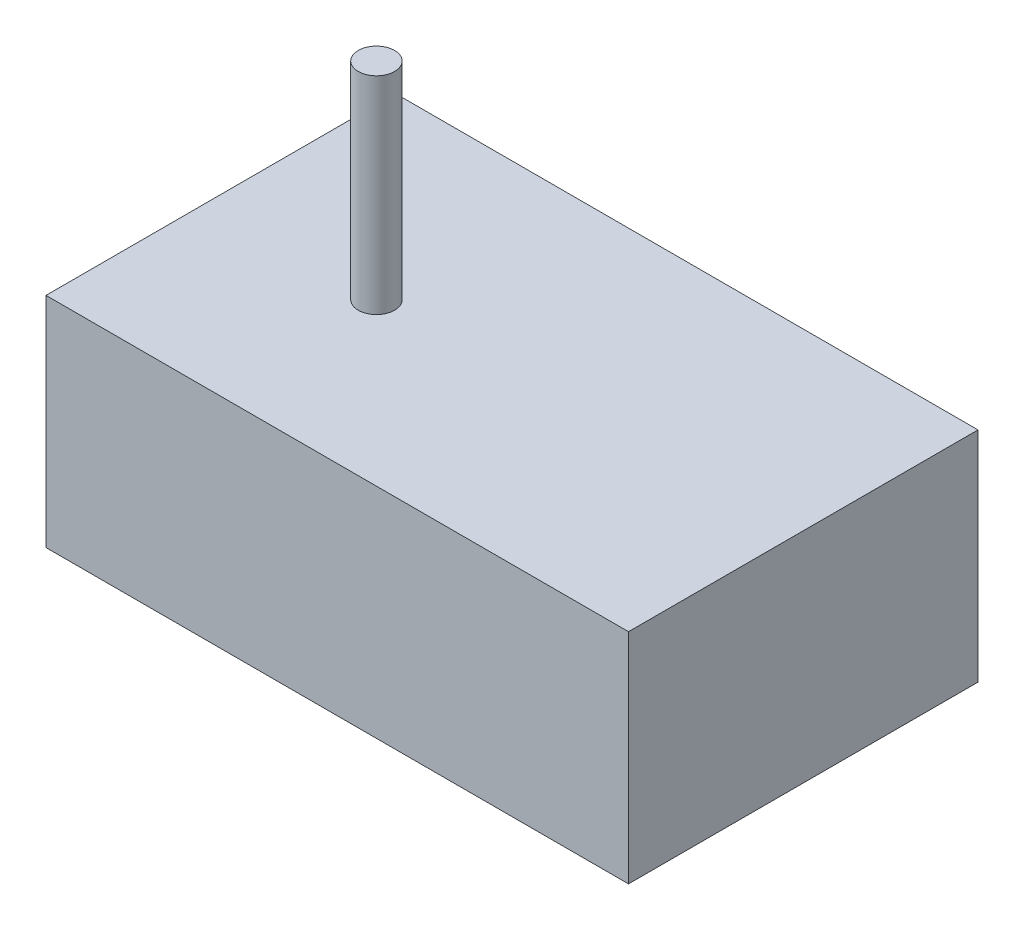
ISO-10303-21;
HEADER;
FILE_DESCRIPTION(('STEP AP214'),'2;1');
FILE_NAME('part.step','',(''),(''),'','','');
FILE_SCHEMA(('AUTOMOTIVE_DESIGN { 1 0 10303 214 1 1 1 1 }'));
ENDSEC;
DATA;
#1=APPLICATION_CONTEXT('core data for automotive mechanical design processes');
#2=APPLICATION_PROTOCOL_DEFINITION('international standard','automotive_design',2000,#1);
#3=PRODUCT_CONTEXT('',#1,'mechanical');
#4=PRODUCT('Part','Part','',(#3));
#5=PRODUCT_RELATED_PRODUCT_CATEGORY('part','',(#4));
#6=PRODUCT_DEFINITION_FORMATION('','',#4);
#7=PRODUCT_DEFINITION_CONTEXT('part definition',#1,'design');
#8=PRODUCT_DEFINITION('design','',#6,#7);
#9=PRODUCT_DEFINITION_SHAPE('','',#8);
#10=(LENGTH_UNIT() NAMED_UNIT(*) SI_UNIT(.MILLI.,.METRE.));
#11=(NAMED_UNIT(*) PLANE_ANGLE_UNIT() SI_UNIT($,.RADIAN.));
#12=(NAMED_UNIT(*) SI_UNIT($,.STERADIAN.) SOLID_ANGLE_UNIT());
#13=UNCERTAINTY_MEASURE_WITH_UNIT(LENGTH_MEASURE(1.E-05),#10,'distance_accuracy_value','');
#14=(GEOMETRIC_REPRESENTATION_CONTEXT(3) GLOBAL_UNCERTAINTY_ASSIGNED_CONTEXT((#13)) GLOBAL_UNIT_ASSIGNED_CONTEXT((#10,
#11,#12)) REPRESENTATION_CONTEXT('',''));
#15=CARTESIAN_POINT('',(0.,0.,0.));
#16=DIRECTION('',(0.,0.,1.));
#17=DIRECTION('',(1.,0.,0.));
#18=AXIS2_PLACEMENT_3D('',#15,#16,#17);
#19=CARTESIAN_POINT('',(0.,2.54,0.));
#20=DIRECTION('',(0.,1.,0.));
#21=DIRECTION('',(0.,0.,1.));
#22=AXIS2_PLACEMENT_3D('',#19,#20,#21);
#23=PLANE('',#22);
#24=CARTESIAN_POINT('',(-0.0874630145731622,2.54,-0.456757564586263));
#25=DIRECTION('',(0.,1.,0.));
#26=DIRECTION('',(0.,0.,1.));
#27=AXIS2_PLACEMENT_3D('',#24,#25,#26);
#28=CIRCLE('',#27,3.19730388073375);
#29=CARTESIAN_POINT('',(-0.0874630145731622,2.54,2.74054631614748));
#30=VERTEX_POINT('',#29);
#31=EDGE_CURVE('E210',#30,#30,#28,.T.);
#32=ORIENTED_EDGE('',*,*,#31,.F.);
#33=EDGE_LOOP('',(#32));
#34=FACE_BOUND('',#33,.T.);
#35=CARTESIAN_POINT('',(-31.75,2.54,2.54));
#36=DIRECTION('',(0.,1.,0.));
#37=DIRECTION('',(0.,0.,1.));
#38=AXIS2_PLACEMENT_3D('',#35,#36,#37);
#39=CIRCLE('',#38,3.175);
#40=CARTESIAN_POINT('',(-31.75,2.54,5.715));
#41=VERTEX_POINT('',#40);
#42=EDGE_CURVE('E215',#41,#41,#39,.T.);
#43=ORIENTED_EDGE('',*,*,#42,.F.);
#44=EDGE_LOOP('',(#43));
#45=FACE_BOUND('',#44,.T.);
#46=DIRECTION('',(0.,0.,1.));
#47=VECTOR('',#46,1.);
#48=CARTESIAN_POINT('',(-48.26,2.54,0.));
#49=LINE('',#48,#47);
#50=CARTESIAN_POINT('',(-48.26,2.54,-27.94));
#51=VERTEX_POINT('',#50);
#52=CARTESIAN_POINT('',(-48.26,2.54,27.94));
#53=VERTEX_POINT('',#52);
#54=EDGE_CURVE('E189',#51,#53,#49,.T.);
#55=ORIENTED_EDGE('',*,*,#54,.T.);
#56=DIRECTION('',(-1.,0.,0.));
#57=VECTOR('',#56,1.);
#58=CARTESIAN_POINT('',(48.26,2.54,27.94));
#59=LINE('',#58,#57);
#60=CARTESIAN_POINT('',(48.26,2.54,27.94));
#61=VERTEX_POINT('',#60);
#62=EDGE_CURVE('E73',#61,#53,#59,.T.);
#63=ORIENTED_EDGE('',*,*,#62,.F.);
#64=DIRECTION('',(0.,0.,1.));
#65=VECTOR('',#64,1.);
#66=CARTESIAN_POINT('',(48.26,2.54,0.));
#67=LINE('',#66,#65);
#68=CARTESIAN_POINT('',(48.26,2.54,-27.94));
#69=VERTEX_POINT('',#68);
#70=EDGE_CURVE('E186',#69,#61,#67,.T.);
#71=ORIENTED_EDGE('',*,*,#70,.F.);
#72=DIRECTION('',(1.,0.,0.));
#73=VECTOR('',#72,1.);
#74=CARTESIAN_POINT('',(-48.26,2.54,-27.94));
#75=LINE('',#74,#73);
#76=EDGE_CURVE('E168',#51,#69,#75,.T.);
#77=ORIENTED_EDGE('',*,*,#76,.F.);
#78=EDGE_LOOP('',(#55,#63,#71,#77));
#79=FACE_BOUND('',#78,.T.);
#80=ADVANCED_FACE('F50',(#34,#45,#79),#23,.T.);
#81=CARTESIAN_POINT('',(-48.26,35.56,0.));
#82=DIRECTION('',(1.,0.,0.));
#83=DIRECTION('',(0.,0.,-1.));
#84=AXIS2_PLACEMENT_3D('',#81,#82,#83);
#85=PLANE('',#84);
#86=DIRECTION('',(0.,0.,1.));
#87=VECTOR('',#86,1.);
#88=CARTESIAN_POINT('',(-48.26,35.56,0.));
#89=LINE('',#88,#87);
#90=CARTESIAN_POINT('',(-48.26,35.56,-27.94));
#91=VERTEX_POINT('',#90);
#92=CARTESIAN_POINT('',(-48.26,35.56,27.94));
#93=VERTEX_POINT('',#92);
#94=EDGE_CURVE('E193',#91,#93,#89,.T.);
#95=ORIENTED_EDGE('',*,*,#94,.T.);
#96=DIRECTION('',(0.,-1.,0.));
#97=VECTOR('',#96,1.);
#98=CARTESIAN_POINT('',(-48.26,35.56,27.94));
#99=LINE('',#98,#97);
#100=EDGE_CURVE('E66',#93,#53,#99,.T.);
#101=ORIENTED_EDGE('',*,*,#100,.T.);
#102=ORIENTED_EDGE('',*,*,#54,.F.);
#103=DIRECTION('',(0.,-1.,0.));
#104=VECTOR('',#103,1.);
#105=CARTESIAN_POINT('',(-48.26,35.56,-27.94));
#106=LINE('',#105,#104);
#107=EDGE_CURVE('E182',#91,#51,#106,.T.);
#108=ORIENTED_EDGE('',*,*,#107,.F.);
#109=EDGE_LOOP('',(#95,#101,#102,#108));
#110=FACE_BOUND('',#109,.T.);
#111=ADVANCED_FACE('F268',(#110),#85,.T.);
#112=CARTESIAN_POINT('',(48.26,35.56,0.));
#113=DIRECTION('',(1.,0.,0.));
#114=DIRECTION('',(0.,0.,-1.));
#115=AXIS2_PLACEMENT_3D('',#112,#113,#114);
#116=PLANE('',#115);
#117=DIRECTION('',(0.,-1.,0.));
#118=VECTOR('',#117,1.);
#119=CARTESIAN_POINT('',(48.26,35.56,27.94));
#120=LINE('',#119,#118);
#121=CARTESIAN_POINT('',(48.26,35.56,27.94));
#122=VERTEX_POINT('',#121);
#123=EDGE_CURVE('E159',#122,#61,#120,.T.);
#124=ORIENTED_EDGE('',*,*,#123,.F.);
#125=DIRECTION('',(0.,0.,1.));
#126=VECTOR('',#125,1.);
#127=CARTESIAN_POINT('',(48.26,35.56,0.));
#128=LINE('',#127,#126);
#129=CARTESIAN_POINT('',(48.26,35.56,-27.94));
#130=VERTEX_POINT('',#129);
#131=EDGE_CURVE('E185',#130,#122,#128,.T.);
#132=ORIENTED_EDGE('',*,*,#131,.F.);
#133=DIRECTION('',(0.,-1.,0.));
#134=VECTOR('',#133,1.);
#135=CARTESIAN_POINT('',(48.26,35.56,-27.94));
#136=LINE('',#135,#134);
#137=EDGE_CURVE('E176',#130,#69,#136,.T.);
#138=ORIENTED_EDGE('',*,*,#137,.T.);
#139=ORIENTED_EDGE('',*,*,#70,.T.);
#140=EDGE_LOOP('',(#124,#132,#138,#139));
#141=FACE_BOUND('',#140,.T.);
#142=ADVANCED_FACE('F247',(#141),#116,.F.);
#143=CARTESIAN_POINT('',(0.,0.,0.));
#144=DIRECTION('',(0.,1.,0.));
#145=DIRECTION('',(0.,0.,1.));
#146=AXIS2_PLACEMENT_3D('',#143,#144,#145);
#147=PLANE('',#146);
#148=CARTESIAN_POINT('',(-0.0874630145731622,0.,-0.456757564586263));
#149=DIRECTION('',(0.,1.,0.));
#150=DIRECTION('',(0.,0.,1.));
#151=AXIS2_PLACEMENT_3D('',#148,#149,#150);
#152=CIRCLE('',#151,3.19730388073375);
#153=CARTESIAN_POINT('',(-0.0874630145731622,0.,2.74054631614748));
#154=VERTEX_POINT('',#153);
#155=EDGE_CURVE('E206',#154,#154,#152,.T.);
#156=ORIENTED_EDGE('',*,*,#155,.T.);
#157=EDGE_LOOP('',(#156));
#158=FACE_BOUND('',#157,.T.);
#159=DIRECTION('',(0.,0.,1.));
#160=VECTOR('',#159,1.);
#161=CARTESIAN_POINT('',(-50.8,0.,30.48));
#162=LINE('',#161,#160);
#163=CARTESIAN_POINT('',(-50.8,0.,-30.48));
#164=VERTEX_POINT('',#163);
#165=CARTESIAN_POINT('',(-50.8,0.,30.48));
#166=VERTEX_POINT('',#165);
#167=EDGE_CURVE('E219',#164,#166,#162,.T.);
#168=ORIENTED_EDGE('',*,*,#167,.F.);
#169=DIRECTION('',(-1.,0.,0.));
#170=VECTOR('',#169,1.);
#171=CARTESIAN_POINT('',(50.8,0.,-30.48));
#172=LINE('',#171,#170);
#173=CARTESIAN_POINT('',(50.8,0.,-30.48));
#174=VERTEX_POINT('',#173);
#175=EDGE_CURVE('E231',#174,#164,#172,.T.);
#176=ORIENTED_EDGE('',*,*,#175,.F.);
#177=DIRECTION('',(0.,0.,-1.));
#178=VECTOR('',#177,1.);
#179=CARTESIAN_POINT('',(50.8,0.,30.48));
#180=LINE('',#179,#178);
#181=CARTESIAN_POINT('',(50.8,0.,30.48));
#182=VERTEX_POINT('',#181);
#183=EDGE_CURVE('E125',#182,#174,#180,.T.);
#184=ORIENTED_EDGE('',*,*,#183,.F.);
#185=DIRECTION('',(1.,0.,0.));
#186=VECTOR('',#185,1.);
#187=CARTESIAN_POINT('',(50.8,0.,30.48));
#188=LINE('',#187,#186);
#189=EDGE_CURVE('E226',#166,#182,#188,.T.);
#190=ORIENTED_EDGE('',*,*,#189,.F.);
#191=EDGE_LOOP('',(#168,#176,#184,#190));
#192=FACE_BOUND('',#191,.T.);
#193=CARTESIAN_POINT('',(-31.75,0.,2.54));
#194=DIRECTION('',(0.,1.,0.));
#195=DIRECTION('',(0.,0.,1.));
#196=AXIS2_PLACEMENT_3D('',#193,#194,#195);
#197=CIRCLE('',#196,3.175);
#198=CARTESIAN_POINT('',(-31.75,0.,5.715));
#199=VERTEX_POINT('',#198);
#200=EDGE_CURVE('E214',#199,#199,#197,.T.);
#201=ORIENTED_EDGE('',*,*,#200,.T.);
#202=EDGE_LOOP('',(#201));
#203=FACE_BOUND('',#202,.T.);
#204=ADVANCED_FACE('F244',(#158,#192,#203),#147,.F.);
#205=CARTESIAN_POINT('',(-50.8,2.54,30.48));
#206=DIRECTION('',(1.,0.,0.));
#207=DIRECTION('',(0.,0.,-1.));
#208=AXIS2_PLACEMENT_3D('',#205,#206,#207);
#209=PLANE('',#208);
#210=ORIENTED_EDGE('',*,*,#167,.T.);
#211=DIRECTION('',(0.,-1.,0.));
#212=VECTOR('',#211,1.);
#213=CARTESIAN_POINT('',(-50.8,2.54,30.48));
#214=LINE('',#213,#212);
#215=CARTESIAN_POINT('',(-50.8,38.1,30.48));
#216=VERTEX_POINT('',#215);
#217=EDGE_CURVE('E59',#216,#166,#214,.T.);
#218=ORIENTED_EDGE('',*,*,#217,.F.);
#219=DIRECTION('',(0.,0.,1.));
#220=VECTOR('',#219,1.);
#221=CARTESIAN_POINT('',(-50.8,38.1,30.48));
#222=LINE('',#221,#220);
#223=CARTESIAN_POINT('',(-50.8,38.1,-30.48));
#224=VERTEX_POINT('',#223);
#225=EDGE_CURVE('E140',#224,#216,#222,.T.);
#226=ORIENTED_EDGE('',*,*,#225,.F.);
#227=DIRECTION('',(0.,-1.,0.));
#228=VECTOR('',#227,1.);
#229=CARTESIAN_POINT('',(-50.8,2.54,-30.48));
#230=LINE('',#229,#228);
#231=EDGE_CURVE('E130',#224,#164,#230,.T.);
#232=ORIENTED_EDGE('',*,*,#231,.T.);
#233=EDGE_LOOP('',(#210,#218,#226,#232));
#234=FACE_BOUND('',#233,.T.);
#235=ADVANCED_FACE('F52',(#234),#209,.F.);
#236=CARTESIAN_POINT('',(50.8,2.54,30.48));
#237=DIRECTION('',(0.,0.,-1.));
#238=DIRECTION('',(-1.,0.,0.));
#239=AXIS2_PLACEMENT_3D('',#236,#237,#238);
#240=PLANE('',#239);
#241=ORIENTED_EDGE('',*,*,#189,.T.);
#242=DIRECTION('',(0.,-1.,0.));
#243=VECTOR('',#242,1.);
#244=CARTESIAN_POINT('',(50.8,2.54,30.48));
#245=LINE('',#244,#243);
#246=CARTESIAN_POINT('',(50.8,38.1,30.48));
#247=VERTEX_POINT('',#246);
#248=EDGE_CURVE('E129',#247,#182,#245,.T.);
#249=ORIENTED_EDGE('',*,*,#248,.F.);
#250=DIRECTION('',(1.,0.,0.));
#251=VECTOR('',#250,1.);
#252=CARTESIAN_POINT('',(50.8,38.1,30.48));
#253=LINE('',#252,#251);
#254=EDGE_CURVE('E145',#216,#247,#253,.T.);
#255=ORIENTED_EDGE('',*,*,#254,.F.);
#256=ORIENTED_EDGE('',*,*,#217,.T.);
#257=EDGE_LOOP('',(#241,#249,#255,#256));
#258=FACE_BOUND('',#257,.T.);
#259=ADVANCED_FACE('F240',(#258),#240,.F.);
#260=CARTESIAN_POINT('',(50.8,2.54,30.48));
#261=DIRECTION('',(-1.,0.,0.));
#262=DIRECTION('',(0.,0.,1.));
#263=AXIS2_PLACEMENT_3D('',#260,#261,#262);
#264=PLANE('',#263);
#265=ORIENTED_EDGE('',*,*,#183,.T.);
#266=DIRECTION('',(0.,-1.,0.));
#267=VECTOR('',#266,1.);
#268=CARTESIAN_POINT('',(50.8,2.54,-30.48));
#269=LINE('',#268,#267);
#270=CARTESIAN_POINT('',(50.8,38.1,-30.48));
#271=VERTEX_POINT('',#270);
#272=EDGE_CURVE('E118',#271,#174,#269,.T.);
#273=ORIENTED_EDGE('',*,*,#272,.F.);
#274=DIRECTION('',(0.,0.,-1.));
#275=VECTOR('',#274,1.);
#276=CARTESIAN_POINT('',(50.8,38.1,30.48));
#277=LINE('',#276,#275);
#278=EDGE_CURVE('E123',#247,#271,#277,.T.);
#279=ORIENTED_EDGE('',*,*,#278,.F.);
#280=ORIENTED_EDGE('',*,*,#248,.T.);
#281=EDGE_LOOP('',(#265,#273,#279,#280));
#282=FACE_BOUND('',#281,.T.);
#283=ADVANCED_FACE('F120',(#282),#264,.F.);
#284=CARTESIAN_POINT('',(50.8,2.54,-30.48));
#285=DIRECTION('',(0.,0.,1.));
#286=DIRECTION('',(1.,0.,0.));
#287=AXIS2_PLACEMENT_3D('',#284,#285,#286);
#288=PLANE('',#287);
#289=ORIENTED_EDGE('',*,*,#175,.T.);
#290=ORIENTED_EDGE('',*,*,#231,.F.);
#291=DIRECTION('',(-1.,0.,0.));
#292=VECTOR('',#291,1.);
#293=CARTESIAN_POINT('',(50.8,38.1,-30.48));
#294=LINE('',#293,#292);
#295=EDGE_CURVE('E133',#271,#224,#294,.T.);
#296=ORIENTED_EDGE('',*,*,#295,.F.);
#297=ORIENTED_EDGE('',*,*,#272,.T.);
#298=EDGE_LOOP('',(#289,#290,#296,#297));
#299=FACE_BOUND('',#298,.T.);
#300=ADVANCED_FACE('F134',(#299),#288,.F.);
#301=CARTESIAN_POINT('',(-31.75,2.54,2.54));
#302=DIRECTION('',(0.,-1.,0.));
#303=DIRECTION('',(0.,0.,-1.));
#304=AXIS2_PLACEMENT_3D('',#301,#302,#303);
#305=CYLINDRICAL_SURFACE('',#304,3.175);
#306=ORIENTED_EDGE('',*,*,#42,.T.);
#307=EDGE_LOOP('',(#306));
#308=FACE_BOUND('',#307,.T.);
#309=ORIENTED_EDGE('',*,*,#200,.F.);
#310=EDGE_LOOP('',(#309));
#311=FACE_BOUND('',#310,.T.);
#312=ADVANCED_FACE('F252',(#308,#311),#305,.F.);
#313=CARTESIAN_POINT('',(-0.0874630145731622,-2.54,-0.456757564586263));
#314=DIRECTION('',(0.,1.,0.));
#315=DIRECTION('',(0.,0.,1.));
#316=AXIS2_PLACEMENT_3D('',#313,#314,#315);
#317=PLANE('',#316);
#318=CARTESIAN_POINT('',(-0.0874630145731622,-2.54,-0.456757564586263));
#319=DIRECTION('',(0.,1.,0.));
#320=DIRECTION('',(0.,0.,1.));
#321=AXIS2_PLACEMENT_3D('',#318,#319,#320);
#322=CIRCLE('',#321,3.19730388073375);
#323=CARTESIAN_POINT('',(-0.0874630145731622,-2.54,2.74054631614748));
#324=VERTEX_POINT('',#323);
#325=EDGE_CURVE('E202',#324,#324,#322,.T.);
#326=ORIENTED_EDGE('',*,*,#325,.F.);
#327=EDGE_LOOP('',(#326));
#328=FACE_BOUND('',#327,.T.);
#329=ADVANCED_FACE('F254',(#328),#317,.F.);
#330=CARTESIAN_POINT('',(-0.0874630145731622,-2.54,-0.456757564586263));
#331=DIRECTION('',(0.,1.,0.));
#332=DIRECTION('',(0.,0.,1.));
#333=AXIS2_PLACEMENT_3D('',#330,#331,#332);
#334=CYLINDRICAL_SURFACE('',#333,3.19730388073375);
#335=ORIENTED_EDGE('',*,*,#325,.T.);
#336=EDGE_LOOP('',(#335));
#337=FACE_BOUND('',#336,.T.);
#338=ORIENTED_EDGE('',*,*,#155,.F.);
#339=EDGE_LOOP('',(#338));
#340=FACE_BOUND('',#339,.T.);
#341=ADVANCED_FACE('F261',(#337,#340),#334,.T.);
#342=ORIENTED_EDGE('',*,*,#31,.T.);
#343=EDGE_LOOP('',(#342));
#344=FACE_BOUND('',#343,.T.);
#345=CARTESIAN_POINT('',(-0.0874630145731622,33.02,-0.456757564586263));
#346=DIRECTION('',(0.,1.,0.));
#347=DIRECTION('',(0.,0.,1.));
#348=AXIS2_PLACEMENT_3D('',#345,#346,#347);
#349=CIRCLE('',#348,3.19730388073375);
#350=CARTESIAN_POINT('',(-0.0874630145731622,33.02,2.74054631614748));
#351=VERTEX_POINT('',#350);
#352=EDGE_CURVE('E196',#351,#351,#349,.T.);
#353=ORIENTED_EDGE('',*,*,#352,.F.);
#354=EDGE_LOOP('',(#353));
#355=FACE_BOUND('',#354,.T.);
#356=ADVANCED_FACE('F317',(#344,#355),#334,.T.);
#357=CARTESIAN_POINT('',(-0.0874630145731622,33.02,-0.456757564586263));
#358=DIRECTION('',(0.,1.,0.));
#359=DIRECTION('',(0.,0.,1.));
#360=AXIS2_PLACEMENT_3D('',#357,#358,#359);
#361=PLANE('',#360);
#362=ORIENTED_EDGE('',*,*,#352,.T.);
#363=EDGE_LOOP('',(#362));
#364=FACE_BOUND('',#363,.T.);
#365=ADVANCED_FACE('F311',(#364),#361,.T.);
#366=CARTESIAN_POINT('',(-48.26,35.56,-27.94));
#367=DIRECTION('',(0.,0.,-1.));
#368=DIRECTION('',(-1.,0.,0.));
#369=AXIS2_PLACEMENT_3D('',#366,#367,#368);
#370=PLANE('',#369);
#371=ORIENTED_EDGE('',*,*,#76,.T.);
#372=ORIENTED_EDGE('',*,*,#137,.F.);
#373=DIRECTION('',(1.,0.,0.));
#374=VECTOR('',#373,1.);
#375=CARTESIAN_POINT('',(-48.26,35.56,-27.94));
#376=LINE('',#375,#374);
#377=EDGE_CURVE('E172',#91,#130,#376,.T.);
#378=ORIENTED_EDGE('',*,*,#377,.F.);
#379=ORIENTED_EDGE('',*,*,#107,.T.);
#380=EDGE_LOOP('',(#371,#372,#378,#379));
#381=FACE_BOUND('',#380,.T.);
#382=ADVANCED_FACE('F316',(#381),#370,.F.);
#383=CARTESIAN_POINT('',(48.26,35.56,27.94));
#384=DIRECTION('',(0.,0.,1.));
#385=DIRECTION('',(1.,0.,0.));
#386=AXIS2_PLACEMENT_3D('',#383,#384,#385);
#387=PLANE('',#386);
#388=ORIENTED_EDGE('',*,*,#62,.T.);
#389=ORIENTED_EDGE('',*,*,#100,.F.);
#390=DIRECTION('',(-1.,0.,0.));
#391=VECTOR('',#390,1.);
#392=CARTESIAN_POINT('',(48.26,35.56,27.94));
#393=LINE('',#392,#391);
#394=EDGE_CURVE('E165',#122,#93,#393,.T.);
#395=ORIENTED_EDGE('',*,*,#394,.F.);
#396=ORIENTED_EDGE('',*,*,#123,.T.);
#397=EDGE_LOOP('',(#388,#389,#395,#396));
#398=FACE_BOUND('',#397,.T.);
#399=ADVANCED_FACE('F405',(#398),#387,.F.);
#400=CARTESIAN_POINT('',(0.,35.56,0.));
#401=DIRECTION('',(0.,1.,0.));
#402=DIRECTION('',(0.,0.,1.));
#403=AXIS2_PLACEMENT_3D('',#400,#401,#402);
#404=PLANE('',#403);
#405=CARTESIAN_POINT('',(-21.3251147913946,35.56,2.32003418285566));
#406=DIRECTION('',(0.,1.,0.));
#407=DIRECTION('',(0.,0.,1.));
#408=AXIS2_PLACEMENT_3D('',#405,#406,#407);
#409=CIRCLE('',#408,3.175);
#410=CARTESIAN_POINT('',(-21.3251147913946,35.56,5.49503418285566));
#411=VERTEX_POINT('',#410);
#412=EDGE_CURVE('E147',#411,#411,#409,.T.);
#413=ORIENTED_EDGE('',*,*,#412,.T.);
#414=EDGE_LOOP('',(#413));
#415=FACE_BOUND('',#414,.T.);
#416=ORIENTED_EDGE('',*,*,#377,.T.);
#417=ORIENTED_EDGE('',*,*,#131,.T.);
#418=ORIENTED_EDGE('',*,*,#394,.T.);
#419=ORIENTED_EDGE('',*,*,#94,.F.);
#420=EDGE_LOOP('',(#416,#417,#418,#419));
#421=FACE_BOUND('',#420,.T.);
#422=ADVANCED_FACE('F435',(#415,#421),#404,.F.);
#423=CARTESIAN_POINT('',(0.,38.1,0.));
#424=DIRECTION('',(0.,1.,0.));
#425=DIRECTION('',(0.,0.,1.));
#426=AXIS2_PLACEMENT_3D('',#423,#424,#425);
#427=PLANE('',#426);
#428=CARTESIAN_POINT('',(-21.3251147913946,38.1,2.32003418285566));
#429=DIRECTION('',(0.,1.,0.));
#430=DIRECTION('',(0.,0.,1.));
#431=AXIS2_PLACEMENT_3D('',#428,#429,#430);
#432=CIRCLE('',#431,3.175);
#433=CARTESIAN_POINT('',(-21.3251147913946,38.1,5.49503418285566));
#434=VERTEX_POINT('',#433);
#435=EDGE_CURVE('E12',#434,#434,#432,.T.);
#436=ORIENTED_EDGE('',*,*,#435,.F.);
#437=EDGE_LOOP('',(#436));
#438=FACE_BOUND('',#437,.T.);
#439=ORIENTED_EDGE('',*,*,#278,.T.);
#440=ORIENTED_EDGE('',*,*,#295,.T.);
#441=ORIENTED_EDGE('',*,*,#225,.T.);
#442=ORIENTED_EDGE('',*,*,#254,.T.);
#443=EDGE_LOOP('',(#439,#440,#441,#442));
#444=FACE_BOUND('',#443,.T.);
#445=ADVANCED_FACE('F143',(#438,#444),#427,.T.);
#446=CARTESIAN_POINT('',(-21.3251147913946,74.168,2.32003418285566));
#447=DIRECTION('',(0.,1.,0.));
#448=DIRECTION('',(0.,0.,1.));
#449=AXIS2_PLACEMENT_3D('',#446,#447,#448);
#450=PLANE('',#449);
#451=CARTESIAN_POINT('',(-21.3251147913946,74.168,2.32003418285566));
#452=DIRECTION('',(0.,1.,0.));
#453=DIRECTION('',(0.,0.,1.));
#454=AXIS2_PLACEMENT_3D('',#451,#452,#453);
#455=CIRCLE('',#454,3.175);
#456=CARTESIAN_POINT('',(-21.3251147913946,74.168,5.49503418285566));
#457=VERTEX_POINT('',#456);
#458=EDGE_CURVE('E526',#457,#457,#455,.T.);
#459=ORIENTED_EDGE('',*,*,#458,.T.);
#460=EDGE_LOOP('',(#459));
#461=FACE_BOUND('',#460,.T.);
#462=ADVANCED_FACE('F452',(#461),#450,.T.);
#463=CARTESIAN_POINT('',(-21.3251147913946,25.4,2.32003418285566));
#464=DIRECTION('',(0.,1.,0.));
#465=DIRECTION('',(0.,0.,1.));
#466=AXIS2_PLACEMENT_3D('',#463,#464,#465);
#467=CYLINDRICAL_SURFACE('',#466,3.175);
#468=CARTESIAN_POINT('',(-21.3251147913946,38.1,5.49503418285566));
#469=CARTESIAN_POINT('',(-21.3251147913946,38.4757083333333,5.49503418285566));
#470=CARTESIAN_POINT('',(-21.3251147913946,38.8514166666667,5.49503418285566));
#471=CARTESIAN_POINT('',(-21.3251147913946,39.6028333333333,5.49503418285566));
#472=CARTESIAN_POINT('',(-21.3251147913946,39.9785416666667,5.49503418285566));
#473=CARTESIAN_POINT('',(-21.3251147913946,40.7299583333333,5.49503418285566));
#474=CARTESIAN_POINT('',(-21.3251147913946,41.1056666666667,5.49503418285566));
#475=CARTESIAN_POINT('',(-21.3251147913946,41.8570833333333,5.49503418285566));
#476=CARTESIAN_POINT('',(-21.3251147913946,42.2327916666667,5.49503418285566));
#477=CARTESIAN_POINT('',(-21.3251147913946,42.9842083333333,5.49503418285566));
#478=CARTESIAN_POINT('',(-21.3251147913946,43.3599166666667,5.49503418285566));
#479=CARTESIAN_POINT('',(-21.3251147913946,44.1113333333333,5.49503418285566));
#480=CARTESIAN_POINT('',(-21.3251147913946,44.4870416666667,5.49503418285566));
#481=CARTESIAN_POINT('',(-21.3251147913946,45.2384583333333,5.49503418285566));
#482=CARTESIAN_POINT('',(-21.3251147913946,45.6141666666667,5.49503418285566));
#483=CARTESIAN_POINT('',(-21.3251147913946,46.3655833333333,5.49503418285566));
#484=CARTESIAN_POINT('',(-21.3251147913946,46.7412916666667,5.49503418285566));
#485=CARTESIAN_POINT('',(-21.3251147913946,47.4927083333333,5.49503418285566));
#486=CARTESIAN_POINT('',(-21.3251147913946,47.8684166666667,5.49503418285566));
#487=CARTESIAN_POINT('',(-21.3251147913946,48.6198333333333,5.49503418285566));
#488=CARTESIAN_POINT('',(-21.3251147913946,48.9955416666667,5.49503418285566));
#489=CARTESIAN_POINT('',(-21.3251147913946,49.7469583333333,5.49503418285566));
#490=CARTESIAN_POINT('',(-21.3251147913946,50.1226666666667,5.49503418285566));
#491=CARTESIAN_POINT('',(-21.3251147913946,50.8740833333333,5.49503418285566));
#492=CARTESIAN_POINT('',(-21.3251147913946,51.2497916666667,5.49503418285566));
#493=CARTESIAN_POINT('',(-21.3251147913946,52.0012083333333,5.49503418285566));
#494=CARTESIAN_POINT('',(-21.3251147913946,52.3769166666667,5.49503418285566));
#495=CARTESIAN_POINT('',(-21.3251147913946,53.1283333333333,5.49503418285566));
#496=CARTESIAN_POINT('',(-21.3251147913946,53.5040416666667,5.49503418285566));
#497=CARTESIAN_POINT('',(-21.3251147913946,54.2554583333333,5.49503418285566));
#498=CARTESIAN_POINT('',(-21.3251147913946,54.6311666666667,5.49503418285566));
#499=CARTESIAN_POINT('',(-21.3251147913946,55.3825833333333,5.49503418285566));
#500=CARTESIAN_POINT('',(-21.3251147913946,55.7582916666667,5.49503418285566));
#501=CARTESIAN_POINT('',(-21.3251147913946,56.5097083333333,5.49503418285566));
#502=CARTESIAN_POINT('',(-21.3251147913946,56.8854166666667,5.49503418285566));
#503=CARTESIAN_POINT('',(-21.3251147913946,57.6368333333333,5.49503418285566));
#504=CARTESIAN_POINT('',(-21.3251147913946,58.0125416666667,5.49503418285566));
#505=CARTESIAN_POINT('',(-21.3251147913946,58.7639583333333,5.49503418285566));
#506=CARTESIAN_POINT('',(-21.3251147913946,59.1396666666667,5.49503418285566));
#507=CARTESIAN_POINT('',(-21.3251147913946,59.8910833333333,5.49503418285566));
#508=CARTESIAN_POINT('',(-21.3251147913946,60.2667916666667,5.49503418285566));
#509=CARTESIAN_POINT('',(-21.3251147913946,61.0182083333333,5.49503418285566));
#510=CARTESIAN_POINT('',(-21.3251147913946,61.3939166666667,5.49503418285566));
#511=CARTESIAN_POINT('',(-21.3251147913946,62.1453333333333,5.49503418285566));
#512=CARTESIAN_POINT('',(-21.3251147913946,62.5210416666667,5.49503418285566));
#513=CARTESIAN_POINT('',(-21.3251147913946,63.2724583333333,5.49503418285566));
#514=CARTESIAN_POINT('',(-21.3251147913946,63.6481666666667,5.49503418285566));
#515=CARTESIAN_POINT('',(-21.3251147913946,64.3995833333333,5.49503418285566));
#516=CARTESIAN_POINT('',(-21.3251147913946,64.7752916666667,5.49503418285566));
#517=CARTESIAN_POINT('',(-21.3251147913946,65.5267083333333,5.49503418285566));
#518=CARTESIAN_POINT('',(-21.3251147913946,65.9024166666667,5.49503418285566));
#519=CARTESIAN_POINT('',(-21.3251147913946,66.6538333333333,5.49503418285566));
#520=CARTESIAN_POINT('',(-21.3251147913946,67.0295416666667,5.49503418285566));
#521=CARTESIAN_POINT('',(-21.3251147913946,67.7809583333333,5.49503418285566));
#522=CARTESIAN_POINT('',(-21.3251147913946,68.1566666666667,5.49503418285566));
#523=CARTESIAN_POINT('',(-21.3251147913946,68.9080833333333,5.49503418285566));
#524=CARTESIAN_POINT('',(-21.3251147913946,69.2837916666667,5.49503418285566));
#525=CARTESIAN_POINT('',(-21.3251147913946,70.0352083333333,5.49503418285566));
#526=CARTESIAN_POINT('',(-21.3251147913946,70.4109166666667,5.49503418285566));
#527=CARTESIAN_POINT('',(-21.3251147913946,71.1623333333333,5.49503418285566));
#528=CARTESIAN_POINT('',(-21.3251147913946,71.5380416666667,5.49503418285566));
#529=CARTESIAN_POINT('',(-21.3251147913946,72.2894583333333,5.49503418285566));
#530=CARTESIAN_POINT('',(-21.3251147913946,72.6651666666667,5.49503418285566));
#531=CARTESIAN_POINT('',(-21.3251147913946,73.4165833333333,5.49503418285566));
#532=CARTESIAN_POINT('',(-21.3251147913946,73.7922916666667,5.49503418285566));
#533=CARTESIAN_POINT('',(-21.3251147913946,74.168,5.49503418285566));
#534=B_SPLINE_CURVE_WITH_KNOTS('',3,(#468,#469,#470,#471,#472,#473,#474,#475,#476,#477,#478,
#479,#480,#481,#482,#483,#484,#485,#486,#487,#488,#489,#490,#491,#492,#493,#494,#495,#496,#497,
#498,#499,#500,#501,#502,#503,#504,#505,#506,#507,#508,#509,#510,#511,#512,#513,#514,#515,#516,
#517,#518,#519,#520,#521,#522,#523,#524,#525,#526,#527,#528,#529,#530,#531,#532,#533),
.UNSPECIFIED.,.F.,.F.,(4,2,2,2,2,2,2,2,2,2,2,2,2,2,2,2,2,2,2,2,2,2,2,2,2,2,2,2,2,2,2,2,4),(0.,
1.127125,2.25425,3.381375,4.50849999999999,5.635625,6.76275,7.889875,9.017,10.144125,11.27125,
12.398375,13.5255,14.652625,15.77975,16.906875,18.034,19.161125,20.28825,21.415375,22.5425,
23.669625,24.79675,25.923875,27.051,28.178125,29.30525,30.432375,31.5595,32.686625,33.81375,
34.940875,36.068),.UNSPECIFIED.);
#535=EDGE_CURVE('BSEAM463',#434,#457,#534,.T.);
#536=ORIENTED_EDGE('',*,*,#435,.T.);
#537=ORIENTED_EDGE('',*,*,#458,.F.);
#538=ORIENTED_EDGE('',*,*,#535,.T.);
#539=ORIENTED_EDGE('',*,*,#535,.F.);
#540=EDGE_LOOP('',(#536,#538,#537,#539));
#541=FACE_BOUND('',#540,.T.);
#542=ADVANCED_FACE('F463',(#541),#467,.T.);
#543=CARTESIAN_POINT('',(-21.3251147913946,25.4,2.32003418285566));
#544=DIRECTION('',(0.,1.,0.));
#545=DIRECTION('',(0.,0.,1.));
#546=AXIS2_PLACEMENT_3D('',#543,#544,#545);
#547=CIRCLE('',#546,3.175);
#548=CARTESIAN_POINT('',(-21.3251147913946,25.4,5.49503418285566));
#549=VERTEX_POINT('',#548);
#550=EDGE_CURVE('E151',#549,#549,#547,.T.);
#551=CARTESIAN_POINT('',(-21.3251147913946,25.4,5.49503418285566));
#552=CARTESIAN_POINT('',(-21.3251147913946,25.5058333333333,5.49503418285566));
#553=CARTESIAN_POINT('',(-21.3251147913946,25.6116666666667,5.49503418285566));
#554=CARTESIAN_POINT('',(-21.3251147913946,25.8233333333333,5.49503418285566));
#555=CARTESIAN_POINT('',(-21.3251147913946,25.9291666666667,5.49503418285566));
#556=CARTESIAN_POINT('',(-21.3251147913946,26.1408333333333,5.49503418285566));
#557=CARTESIAN_POINT('',(-21.3251147913946,26.2466666666667,5.49503418285566));
#558=CARTESIAN_POINT('',(-21.3251147913946,26.4583333333333,5.49503418285566));
#559=CARTESIAN_POINT('',(-21.3251147913946,26.5641666666667,5.49503418285566));
#560=CARTESIAN_POINT('',(-21.3251147913946,26.7758333333333,5.49503418285566));
#561=CARTESIAN_POINT('',(-21.3251147913946,26.8816666666667,5.49503418285566));
#562=CARTESIAN_POINT('',(-21.3251147913946,27.0933333333333,5.49503418285566));
#563=CARTESIAN_POINT('',(-21.3251147913946,27.1991666666667,5.49503418285566));
#564=CARTESIAN_POINT('',(-21.3251147913946,27.4108333333333,5.49503418285566));
#565=CARTESIAN_POINT('',(-21.3251147913946,27.5166666666667,5.49503418285566));
#566=CARTESIAN_POINT('',(-21.3251147913946,27.7283333333333,5.49503418285566));
#567=CARTESIAN_POINT('',(-21.3251147913946,27.8341666666667,5.49503418285566));
#568=CARTESIAN_POINT('',(-21.3251147913946,28.0458333333333,5.49503418285566));
#569=CARTESIAN_POINT('',(-21.3251147913946,28.1516666666667,5.49503418285566));
#570=CARTESIAN_POINT('',(-21.3251147913946,28.3633333333333,5.49503418285566));
#571=CARTESIAN_POINT('',(-21.3251147913946,28.4691666666667,5.49503418285566));
#572=CARTESIAN_POINT('',(-21.3251147913946,28.6808333333333,5.49503418285566));
#573=CARTESIAN_POINT('',(-21.3251147913946,28.7866666666667,5.49503418285566));
#574=CARTESIAN_POINT('',(-21.3251147913946,28.9983333333333,5.49503418285566));
#575=CARTESIAN_POINT('',(-21.3251147913946,29.1041666666667,5.49503418285566));
#576=CARTESIAN_POINT('',(-21.3251147913946,29.3158333333333,5.49503418285566));
#577=CARTESIAN_POINT('',(-21.3251147913946,29.4216666666667,5.49503418285566));
#578=CARTESIAN_POINT('',(-21.3251147913946,29.6333333333333,5.49503418285566));
#579=CARTESIAN_POINT('',(-21.3251147913946,29.7391666666667,5.49503418285566));
#580=CARTESIAN_POINT('',(-21.3251147913946,29.9508333333333,5.49503418285566));
#581=CARTESIAN_POINT('',(-21.3251147913946,30.0566666666667,5.49503418285566));
#582=CARTESIAN_POINT('',(-21.3251147913946,30.2683333333333,5.49503418285566));
#583=CARTESIAN_POINT('',(-21.3251147913946,30.3741666666667,5.49503418285566));
#584=CARTESIAN_POINT('',(-21.3251147913946,30.5858333333333,5.49503418285566));
#585=CARTESIAN_POINT('',(-21.3251147913946,30.6916666666667,5.49503418285566));
#586=CARTESIAN_POINT('',(-21.3251147913946,30.9033333333333,5.49503418285566));
#587=CARTESIAN_POINT('',(-21.3251147913946,31.0091666666667,5.49503418285566));
#588=CARTESIAN_POINT('',(-21.3251147913946,31.2208333333333,5.49503418285566));
#589=CARTESIAN_POINT('',(-21.3251147913946,31.3266666666667,5.49503418285566));
#590=CARTESIAN_POINT('',(-21.3251147913946,31.5383333333333,5.49503418285566));
#591=CARTESIAN_POINT('',(-21.3251147913946,31.6441666666667,5.49503418285566));
#592=CARTESIAN_POINT('',(-21.3251147913946,31.8558333333333,5.49503418285566));
#593=CARTESIAN_POINT('',(-21.3251147913946,31.9616666666667,5.49503418285566));
#594=CARTESIAN_POINT('',(-21.3251147913946,32.1733333333333,5.49503418285566));
#595=CARTESIAN_POINT('',(-21.3251147913946,32.2791666666667,5.49503418285566));
#596=CARTESIAN_POINT('',(-21.3251147913946,32.4908333333333,5.49503418285566));
#597=CARTESIAN_POINT('',(-21.3251147913946,32.5966666666667,5.49503418285566));
#598=CARTESIAN_POINT('',(-21.3251147913946,32.8083333333333,5.49503418285566));
#599=CARTESIAN_POINT('',(-21.3251147913946,32.9141666666667,5.49503418285566));
#600=CARTESIAN_POINT('',(-21.3251147913946,33.1258333333333,5.49503418285566));
#601=CARTESIAN_POINT('',(-21.3251147913946,33.2316666666667,5.49503418285566));
#602=CARTESIAN_POINT('',(-21.3251147913946,33.4433333333333,5.49503418285566));
#603=CARTESIAN_POINT('',(-21.3251147913946,33.5491666666667,5.49503418285566));
#604=CARTESIAN_POINT('',(-21.3251147913946,33.7608333333333,5.49503418285566));
#605=CARTESIAN_POINT('',(-21.3251147913946,33.8666666666667,5.49503418285566));
#606=CARTESIAN_POINT('',(-21.3251147913946,34.0783333333333,5.49503418285566));
#607=CARTESIAN_POINT('',(-21.3251147913946,34.1841666666667,5.49503418285566));
#608=CARTESIAN_POINT('',(-21.3251147913946,34.3958333333333,5.49503418285566));
#609=CARTESIAN_POINT('',(-21.3251147913946,34.5016666666667,5.49503418285566));
#610=CARTESIAN_POINT('',(-21.3251147913946,34.7133333333333,5.49503418285566));
#611=CARTESIAN_POINT('',(-21.3251147913946,34.8191666666667,5.49503418285566));
#612=CARTESIAN_POINT('',(-21.3251147913946,35.0308333333333,5.49503418285566));
#613=CARTESIAN_POINT('',(-21.3251147913946,35.1366666666667,5.49503418285566));
#614=CARTESIAN_POINT('',(-21.3251147913946,35.3483333333333,5.49503418285566));
#615=CARTESIAN_POINT('',(-21.3251147913946,35.4541666666667,5.49503418285566));
#616=CARTESIAN_POINT('',(-21.3251147913946,35.56,5.49503418285566));
#617=B_SPLINE_CURVE_WITH_KNOTS('',3,(#551,#552,#553,#554,#555,#556,#557,#558,#559,#560,#561,
#562,#563,#564,#565,#566,#567,#568,#569,#570,#571,#572,#573,#574,#575,#576,#577,#578,#579,#580,
#581,#582,#583,#584,#585,#586,#587,#588,#589,#590,#591,#592,#593,#594,#595,#596,#597,#598,#599,
#600,#601,#602,#603,#604,#605,#606,#607,#608,#609,#610,#611,#612,#613,#614,#615,#616),
.UNSPECIFIED.,.F.,.F.,(4,2,2,2,2,2,2,2,2,2,2,2,2,2,2,2,2,2,2,2,2,2,2,2,2,2,2,2,2,2,2,2,4),(0.,
0.317499999999998,0.634999999999997,0.952499999999998,1.27,1.5875,1.905,2.2225,2.54,2.8575,
3.175,3.4925,3.81,4.1275,4.445,4.7625,5.08,5.3975,5.715,6.0325,6.35,6.6675,6.985,7.3025,7.62,
7.9375,8.255,8.5725,8.89,9.2075,9.525,9.8425,10.16),.UNSPECIFIED.);
#618=EDGE_CURVE('BSEAM474',#549,#411,#617,.T.);
#619=ORIENTED_EDGE('',*,*,#550,.T.);
#620=ORIENTED_EDGE('',*,*,#412,.F.);
#621=ORIENTED_EDGE('',*,*,#618,.T.);
#622=ORIENTED_EDGE('',*,*,#618,.F.);
#623=EDGE_LOOP('',(#619,#621,#620,#622));
#624=FACE_BOUND('',#623,.T.);
#625=ADVANCED_FACE('F474',(#624),#467,.T.);
#626=CARTESIAN_POINT('',(-21.3251147913946,25.4,2.32003418285566));
#627=DIRECTION('',(0.,1.,0.));
#628=DIRECTION('',(0.,0.,1.));
#629=AXIS2_PLACEMENT_3D('',#626,#627,#628);
#630=PLANE('',#629);
#631=ORIENTED_EDGE('',*,*,#550,.F.);
#632=EDGE_LOOP('',(#631));
#633=FACE_BOUND('',#632,.T.);
#634=ADVANCED_FACE('F485',(#633),#630,.F.);
#635=CLOSED_SHELL('',(#80,#111,#142,#204,#235,#259,#283,#300,#312,#329,#341,#356,#365,#382,#399,
#422,#445,#462,#542,#625,#634));
#636=MANIFOLD_SOLID_BREP('B2',#635);
#637=ADVANCED_BREP_SHAPE_REPRESENTATION('',(#18,#636),#14);
#638=SHAPE_DEFINITION_REPRESENTATION(#9,#637);
ENDSEC;
END-ISO-10303-21;
